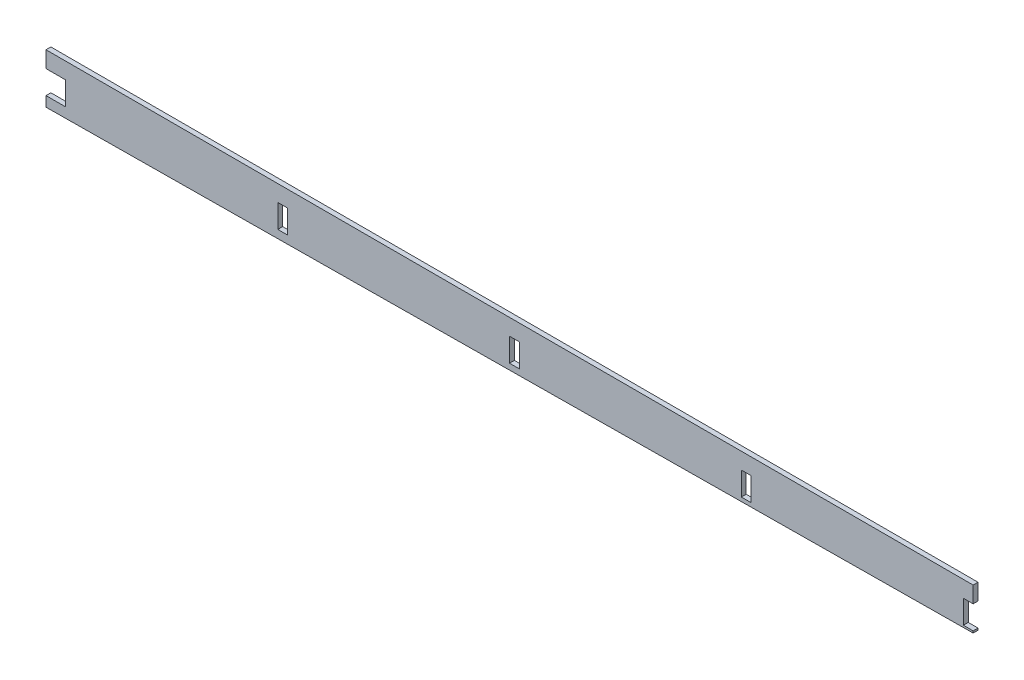
ISO-10303-21;
HEADER;
FILE_DESCRIPTION(('STEP AP214'),'2;1');
FILE_NAME('part.step','',(''),(''),'','','');
FILE_SCHEMA(('AUTOMOTIVE_DESIGN { 1 0 10303 214 1 1 1 1 }'));
ENDSEC;
DATA;
#1=APPLICATION_CONTEXT('core data for automotive mechanical design processes');
#2=APPLICATION_PROTOCOL_DEFINITION('international standard','automotive_design',2000,#1);
#3=PRODUCT_CONTEXT('',#1,'mechanical');
#4=PRODUCT('Part','Part','',(#3));
#5=PRODUCT_RELATED_PRODUCT_CATEGORY('part','',(#4));
#6=PRODUCT_DEFINITION_FORMATION('','',#4);
#7=PRODUCT_DEFINITION_CONTEXT('part definition',#1,'design');
#8=PRODUCT_DEFINITION('design','',#6,#7);
#9=PRODUCT_DEFINITION_SHAPE('','',#8);
#10=(LENGTH_UNIT() NAMED_UNIT(*) SI_UNIT(.MILLI.,.METRE.));
#11=(NAMED_UNIT(*) PLANE_ANGLE_UNIT() SI_UNIT($,.RADIAN.));
#12=(NAMED_UNIT(*) SI_UNIT($,.STERADIAN.) SOLID_ANGLE_UNIT());
#13=UNCERTAINTY_MEASURE_WITH_UNIT(LENGTH_MEASURE(1.E-05),#10,'distance_accuracy_value','');
#14=(GEOMETRIC_REPRESENTATION_CONTEXT(3) GLOBAL_UNCERTAINTY_ASSIGNED_CONTEXT((#13)) GLOBAL_UNIT_ASSIGNED_CONTEXT((#10,
#11,#12)) REPRESENTATION_CONTEXT('',''));
#15=CARTESIAN_POINT('',(0.,0.,0.));
#16=DIRECTION('',(0.,0.,1.));
#17=DIRECTION('',(1.,0.,0.));
#18=AXIS2_PLACEMENT_3D('',#15,#16,#17);
#19=CARTESIAN_POINT('',(0.,0.,1.5875));
#20=DIRECTION('',(0.,0.,1.));
#21=DIRECTION('',(1.,0.,0.));
#22=AXIS2_PLACEMENT_3D('',#19,#20,#21);
#23=PLANE('',#22);
#24=DIRECTION('',(0.,1.,0.));
#25=VECTOR('',#24,1.);
#26=CARTESIAN_POINT('',(232.626798957982,26.1529796334205,1.5875));
#27=LINE('',#26,#25);
#28=CARTESIAN_POINT('',(232.626798957982,25.5277726852554,1.5875));
#29=VERTEX_POINT('',#28);
#30=CARTESIAN_POINT('',(232.626798957982,26.1529796334205,1.5875));
#31=VERTEX_POINT('',#30);
#32=EDGE_CURVE('E291',#29,#31,#27,.T.);
#33=ORIENTED_EDGE('',*,*,#32,.T.);
#34=DIRECTION('',(-1.,0.,0.));
#35=VECTOR('',#34,1.);
#36=CARTESIAN_POINT('',(229.451798957982,26.1529796334205,1.5875));
#37=LINE('',#36,#35);
#38=CARTESIAN_POINT('',(229.451798957982,26.1529796334205,1.5875));
#39=VERTEX_POINT('',#38);
#40=EDGE_CURVE('E294',#31,#39,#37,.T.);
#41=ORIENTED_EDGE('',*,*,#40,.T.);
#42=DIRECTION('',(0.,1.,0.));
#43=VECTOR('',#42,1.);
#44=CARTESIAN_POINT('',(229.451798957982,33.7729796334204,1.5875));
#45=LINE('',#44,#43);
#46=CARTESIAN_POINT('',(229.451798957982,33.7729796334204,1.5875));
#47=VERTEX_POINT('',#46);
#48=EDGE_CURVE('E297',#39,#47,#45,.T.);
#49=ORIENTED_EDGE('',*,*,#48,.T.);
#50=DIRECTION('',(1.,0.,0.));
#51=VECTOR('',#50,1.);
#52=CARTESIAN_POINT('',(232.626798957982,33.7729796334204,1.5875));
#53=LINE('',#52,#51);
#54=CARTESIAN_POINT('',(232.626798957982,33.7729796334204,1.5875));
#55=VERTEX_POINT('',#54);
#56=EDGE_CURVE('E299',#47,#55,#53,.T.);
#57=ORIENTED_EDGE('',*,*,#56,.T.);
#58=DIRECTION('',(0.,1.,0.));
#59=VECTOR('',#58,1.);
#60=CARTESIAN_POINT('',(232.626798957982,39.0942654896149,1.5875));
#61=LINE('',#60,#59);
#62=CARTESIAN_POINT('',(232.626798957982,39.0942654896149,1.5875));
#63=VERTEX_POINT('',#62);
#64=EDGE_CURVE('E301',#55,#63,#61,.T.);
#65=ORIENTED_EDGE('',*,*,#64,.T.);
#66=DIRECTION('',(-1.,0.,0.));
#67=VECTOR('',#66,1.);
#68=CARTESIAN_POINT('',(-69.6332010420179,39.0942654896149,1.5875));
#69=LINE('',#68,#67);
#70=CARTESIAN_POINT('',(-69.6332010420179,39.0942654896149,1.5875));
#71=VERTEX_POINT('',#70);
#72=EDGE_CURVE('E303',#63,#71,#69,.T.);
#73=ORIENTED_EDGE('',*,*,#72,.T.);
#74=DIRECTION('',(0.,-1.,0.));
#75=VECTOR('',#74,1.);
#76=CARTESIAN_POINT('',(-69.6332010420179,33.7729796334204,1.5875));
#77=LINE('',#76,#75);
#78=CARTESIAN_POINT('',(-69.6332010420179,33.7729796334204,1.5875));
#79=VERTEX_POINT('',#78);
#80=EDGE_CURVE('E305',#71,#79,#77,.T.);
#81=ORIENTED_EDGE('',*,*,#80,.T.);
#82=DIRECTION('',(1.,0.,0.));
#83=VECTOR('',#82,1.);
#84=CARTESIAN_POINT('',(-63.2832010420179,33.7729796334204,1.5875));
#85=LINE('',#84,#83);
#86=CARTESIAN_POINT('',(-63.2832010420179,33.7729796334204,1.5875));
#87=VERTEX_POINT('',#86);
#88=EDGE_CURVE('E307',#79,#87,#85,.T.);
#89=ORIENTED_EDGE('',*,*,#88,.T.);
#90=DIRECTION('',(0.,-1.,0.));
#91=VECTOR('',#90,1.);
#92=CARTESIAN_POINT('',(-63.2832010420179,26.1529796334205,1.5875));
#93=LINE('',#92,#91);
#94=CARTESIAN_POINT('',(-63.2832010420179,26.1529796334205,1.5875));
#95=VERTEX_POINT('',#94);
#96=EDGE_CURVE('E309',#87,#95,#93,.T.);
#97=ORIENTED_EDGE('',*,*,#96,.T.);
#98=DIRECTION('',(-1.,0.,0.));
#99=VECTOR('',#98,1.);
#100=CARTESIAN_POINT('',(-69.6332010420179,26.1529796334205,1.5875));
#101=LINE('',#100,#99);
#102=CARTESIAN_POINT('',(-69.6332010420179,26.1529796334205,1.5875));
#103=VERTEX_POINT('',#102);
#104=EDGE_CURVE('E311',#95,#103,#101,.T.);
#105=ORIENTED_EDGE('',*,*,#104,.T.);
#106=DIRECTION('',(0.,-1.,0.));
#107=VECTOR('',#106,1.);
#108=CARTESIAN_POINT('',(-69.6332010420179,22.8671224610524,1.5875));
#109=LINE('',#108,#107);
#110=CARTESIAN_POINT('',(-69.6332010420179,22.8671224610524,1.5875));
#111=VERTEX_POINT('',#110);
#112=EDGE_CURVE('E313',#103,#111,#109,.T.);
#113=ORIENTED_EDGE('',*,*,#112,.T.);
#114=DIRECTION('',(0.99996126005671,0.00880218074096521,0.));
#115=VECTOR('',#114,1.);
#116=CARTESIAN_POINT('',(232.626798957982,25.5277726852554,1.5875));
#117=LINE('',#116,#115);
#118=EDGE_CURVE('E315',#111,#29,#117,.T.);
#119=ORIENTED_EDGE('',*,*,#118,.T.);
#120=EDGE_LOOP('',(#33,#41,#49,#57,#65,#73,#81,#89,#97,#105,#113,#119));
#121=FACE_BOUND('',#120,.T.);
#122=DIRECTION('',(-1.,0.,0.));
#123=VECTOR('',#122,1.);
#124=CARTESIAN_POINT('',(157.061798957982,33.7729796334204,1.5875));
#125=LINE('',#124,#123);
#126=CARTESIAN_POINT('',(160.236798957982,33.7729796334204,1.5875));
#127=VERTEX_POINT('',#126);
#128=CARTESIAN_POINT('',(157.061798957982,33.7729796334204,1.5875));
#129=VERTEX_POINT('',#128);
#130=EDGE_CURVE('E262',#127,#129,#125,.T.);
#131=ORIENTED_EDGE('',*,*,#130,.F.);
#132=DIRECTION('',(0.,1.,0.));
#133=VECTOR('',#132,1.);
#134=CARTESIAN_POINT('',(160.236798957982,33.7729796334204,1.5875));
#135=LINE('',#134,#133);
#136=CARTESIAN_POINT('',(160.236798957982,26.1529796334204,1.5875));
#137=VERTEX_POINT('',#136);
#138=EDGE_CURVE('E260',#137,#127,#135,.T.);
#139=ORIENTED_EDGE('',*,*,#138,.F.);
#140=DIRECTION('',(1.,0.,0.));
#141=VECTOR('',#140,1.);
#142=CARTESIAN_POINT('',(160.236798957982,26.1529796334204,1.5875));
#143=LINE('',#142,#141);
#144=CARTESIAN_POINT('',(157.061798957982,26.1529796334204,1.5875));
#145=VERTEX_POINT('',#144);
#146=EDGE_CURVE('E268',#145,#137,#143,.T.);
#147=ORIENTED_EDGE('',*,*,#146,.F.);
#148=DIRECTION('',(0.,-1.,0.));
#149=VECTOR('',#148,1.);
#150=CARTESIAN_POINT('',(157.061798957982,26.1529796334204,1.5875));
#151=LINE('',#150,#149);
#152=EDGE_CURVE('E265',#129,#145,#151,.T.);
#153=ORIENTED_EDGE('',*,*,#152,.F.);
#154=EDGE_LOOP('',(#131,#139,#147,#153));
#155=FACE_BOUND('',#154,.T.);
#156=DIRECTION('',(-1.,0.,0.));
#157=VECTOR('',#156,1.);
#158=CARTESIAN_POINT('',(81.496798957982,33.7729796334204,1.5875));
#159=LINE('',#158,#157);
#160=CARTESIAN_POINT('',(84.671798957982,33.7729796334204,1.5875));
#161=VERTEX_POINT('',#160);
#162=CARTESIAN_POINT('',(81.496798957982,33.7729796334204,1.5875));
#163=VERTEX_POINT('',#162);
#164=EDGE_CURVE('E231',#161,#163,#159,.T.);
#165=ORIENTED_EDGE('',*,*,#164,.F.);
#166=DIRECTION('',(0.,1.,0.));
#167=VECTOR('',#166,1.);
#168=CARTESIAN_POINT('',(84.671798957982,33.7729796334204,1.5875));
#169=LINE('',#168,#167);
#170=CARTESIAN_POINT('',(84.671798957982,26.1529796334204,1.5875));
#171=VERTEX_POINT('',#170);
#172=EDGE_CURVE('E229',#171,#161,#169,.T.);
#173=ORIENTED_EDGE('',*,*,#172,.F.);
#174=DIRECTION('',(1.,0.,0.));
#175=VECTOR('',#174,1.);
#176=CARTESIAN_POINT('',(84.671798957982,26.1529796334204,1.5875));
#177=LINE('',#176,#175);
#178=CARTESIAN_POINT('',(81.496798957982,26.1529796334204,1.5875));
#179=VERTEX_POINT('',#178);
#180=EDGE_CURVE('E237',#179,#171,#177,.T.);
#181=ORIENTED_EDGE('',*,*,#180,.F.);
#182=DIRECTION('',(0.,-1.,0.));
#183=VECTOR('',#182,1.);
#184=CARTESIAN_POINT('',(81.496798957982,26.1529796334204,1.5875));
#185=LINE('',#184,#183);
#186=EDGE_CURVE('E234',#163,#179,#185,.T.);
#187=ORIENTED_EDGE('',*,*,#186,.F.);
#188=EDGE_LOOP('',(#165,#173,#181,#187));
#189=FACE_BOUND('',#188,.T.);
#190=DIRECTION('',(-1.,0.,0.));
#191=VECTOR('',#190,1.);
#192=CARTESIAN_POINT('',(5.93179895798208,33.7729796334204,1.5875));
#193=LINE('',#192,#191);
#194=CARTESIAN_POINT('',(9.10679895798208,33.7729796334204,1.5875));
#195=VERTEX_POINT('',#194);
#196=CARTESIAN_POINT('',(5.93179895798208,33.7729796334204,1.5875));
#197=VERTEX_POINT('',#196);
#198=EDGE_CURVE('E201',#195,#197,#193,.T.);
#199=ORIENTED_EDGE('',*,*,#198,.F.);
#200=DIRECTION('',(0.,1.,0.));
#201=VECTOR('',#200,1.);
#202=CARTESIAN_POINT('',(9.10679895798208,33.7729796334204,1.5875));
#203=LINE('',#202,#201);
#204=CARTESIAN_POINT('',(9.10679895798208,26.1529796334204,1.5875));
#205=VERTEX_POINT('',#204);
#206=EDGE_CURVE('E193',#205,#195,#203,.T.);
#207=ORIENTED_EDGE('',*,*,#206,.F.);
#208=DIRECTION('',(1.,0.,0.));
#209=VECTOR('',#208,1.);
#210=CARTESIAN_POINT('',(9.10679895798208,26.1529796334204,1.5875));
#211=LINE('',#210,#209);
#212=CARTESIAN_POINT('',(5.93179895798208,26.1529796334205,1.5875));
#213=VERTEX_POINT('',#212);
#214=EDGE_CURVE('E215',#213,#205,#211,.T.);
#215=ORIENTED_EDGE('',*,*,#214,.F.);
#216=DIRECTION('',(0.,-1.,0.));
#217=VECTOR('',#216,1.);
#218=CARTESIAN_POINT('',(5.93179895798208,26.1529796334205,1.5875));
#219=LINE('',#218,#217);
#220=EDGE_CURVE('E213',#197,#213,#219,.T.);
#221=ORIENTED_EDGE('',*,*,#220,.F.);
#222=EDGE_LOOP('',(#199,#207,#215,#221));
#223=FACE_BOUND('',#222,.T.);
#224=ADVANCED_FACE('F32',(#121,#155,#189,#223),#23,.T.);
#225=CARTESIAN_POINT('',(0.,0.,0.));
#226=DIRECTION('',(0.,0.,1.));
#227=DIRECTION('',(1.,0.,0.));
#228=AXIS2_PLACEMENT_3D('',#225,#226,#227);
#229=PLANE('',#228);
#230=DIRECTION('',(0.,1.,0.));
#231=VECTOR('',#230,1.);
#232=CARTESIAN_POINT('',(84.671798957982,33.7729796334204,0.));
#233=LINE('',#232,#231);
#234=CARTESIAN_POINT('',(84.671798957982,26.1529796334204,0.));
#235=VERTEX_POINT('',#234);
#236=CARTESIAN_POINT('',(84.671798957982,33.7729796334204,0.));
#237=VERTEX_POINT('',#236);
#238=EDGE_CURVE('E209',#235,#237,#233,.T.);
#239=ORIENTED_EDGE('',*,*,#238,.T.);
#240=DIRECTION('',(-1.,0.,0.));
#241=VECTOR('',#240,1.);
#242=CARTESIAN_POINT('',(81.496798957982,33.7729796334204,0.));
#243=LINE('',#242,#241);
#244=CARTESIAN_POINT('',(81.496798957982,33.7729796334204,0.));
#245=VERTEX_POINT('',#244);
#246=EDGE_CURVE('E242',#237,#245,#243,.T.);
#247=ORIENTED_EDGE('',*,*,#246,.T.);
#248=DIRECTION('',(0.,-1.,0.));
#249=VECTOR('',#248,1.);
#250=CARTESIAN_POINT('',(81.496798957982,26.1529796334204,0.));
#251=LINE('',#250,#249);
#252=CARTESIAN_POINT('',(81.496798957982,26.1529796334204,0.));
#253=VERTEX_POINT('',#252);
#254=EDGE_CURVE('E245',#245,#253,#251,.T.);
#255=ORIENTED_EDGE('',*,*,#254,.T.);
#256=DIRECTION('',(1.,0.,0.));
#257=VECTOR('',#256,1.);
#258=CARTESIAN_POINT('',(84.671798957982,26.1529796334204,0.));
#259=LINE('',#258,#257);
#260=EDGE_CURVE('E232',#253,#235,#259,.T.);
#261=ORIENTED_EDGE('',*,*,#260,.T.);
#262=EDGE_LOOP('',(#239,#247,#255,#261));
#263=FACE_BOUND('',#262,.T.);
#264=DIRECTION('',(0.,1.,0.));
#265=VECTOR('',#264,1.);
#266=CARTESIAN_POINT('',(232.626798957982,26.1529796334205,0.));
#267=LINE('',#266,#265);
#268=CARTESIAN_POINT('',(232.626798957982,25.5277726852554,0.));
#269=VERTEX_POINT('',#268);
#270=CARTESIAN_POINT('',(232.626798957982,26.1529796334205,0.));
#271=VERTEX_POINT('',#270);
#272=EDGE_CURVE('E290',#269,#271,#267,.T.);
#273=ORIENTED_EDGE('',*,*,#272,.F.);
#274=DIRECTION('',(0.99996126005671,0.00880218074096521,0.));
#275=VECTOR('',#274,1.);
#276=CARTESIAN_POINT('',(232.626798957982,25.5277726852554,0.));
#277=LINE('',#276,#275);
#278=CARTESIAN_POINT('',(-69.6332010420179,22.8671224610524,0.));
#279=VERTEX_POINT('',#278);
#280=EDGE_CURVE('E295',#279,#269,#277,.T.);
#281=ORIENTED_EDGE('',*,*,#280,.F.);
#282=DIRECTION('',(0.,-1.,0.));
#283=VECTOR('',#282,1.);
#284=CARTESIAN_POINT('',(-69.6332010420179,22.8671224610524,0.));
#285=LINE('',#284,#283);
#286=CARTESIAN_POINT('',(-69.6332010420179,26.1529796334205,0.));
#287=VERTEX_POINT('',#286);
#288=EDGE_CURVE('E338',#287,#279,#285,.T.);
#289=ORIENTED_EDGE('',*,*,#288,.F.);
#290=DIRECTION('',(-1.,0.,0.));
#291=VECTOR('',#290,1.);
#292=CARTESIAN_POINT('',(-69.6332010420179,26.1529796334205,0.));
#293=LINE('',#292,#291);
#294=CARTESIAN_POINT('',(-63.2832010420179,26.1529796334205,0.));
#295=VERTEX_POINT('',#294);
#296=EDGE_CURVE('E336',#295,#287,#293,.T.);
#297=ORIENTED_EDGE('',*,*,#296,.F.);
#298=DIRECTION('',(0.,-1.,0.));
#299=VECTOR('',#298,1.);
#300=CARTESIAN_POINT('',(-63.2832010420179,26.1529796334205,0.));
#301=LINE('',#300,#299);
#302=CARTESIAN_POINT('',(-63.2832010420179,33.7729796334204,0.));
#303=VERTEX_POINT('',#302);
#304=EDGE_CURVE('E334',#303,#295,#301,.T.);
#305=ORIENTED_EDGE('',*,*,#304,.F.);
#306=DIRECTION('',(1.,0.,0.));
#307=VECTOR('',#306,1.);
#308=CARTESIAN_POINT('',(-63.2832010420179,33.7729796334204,0.));
#309=LINE('',#308,#307);
#310=CARTESIAN_POINT('',(-69.6332010420179,33.7729796334204,0.));
#311=VERTEX_POINT('',#310);
#312=EDGE_CURVE('E332',#311,#303,#309,.T.);
#313=ORIENTED_EDGE('',*,*,#312,.F.);
#314=DIRECTION('',(0.,-1.,0.));
#315=VECTOR('',#314,1.);
#316=CARTESIAN_POINT('',(-69.6332010420179,33.7729796334204,0.));
#317=LINE('',#316,#315);
#318=CARTESIAN_POINT('',(-69.6332010420179,39.0942654896149,0.));
#319=VERTEX_POINT('',#318);
#320=EDGE_CURVE('E330',#319,#311,#317,.T.);
#321=ORIENTED_EDGE('',*,*,#320,.F.);
#322=DIRECTION('',(-1.,0.,0.));
#323=VECTOR('',#322,1.);
#324=CARTESIAN_POINT('',(-69.6332010420179,39.0942654896149,0.));
#325=LINE('',#324,#323);
#326=CARTESIAN_POINT('',(232.626798957982,39.0942654896149,0.));
#327=VERTEX_POINT('',#326);
#328=EDGE_CURVE('E328',#327,#319,#325,.T.);
#329=ORIENTED_EDGE('',*,*,#328,.F.);
#330=DIRECTION('',(0.,1.,0.));
#331=VECTOR('',#330,1.);
#332=CARTESIAN_POINT('',(232.626798957982,39.0942654896149,0.));
#333=LINE('',#332,#331);
#334=CARTESIAN_POINT('',(232.626798957982,33.7729796334204,0.));
#335=VERTEX_POINT('',#334);
#336=EDGE_CURVE('E326',#335,#327,#333,.T.);
#337=ORIENTED_EDGE('',*,*,#336,.F.);
#338=DIRECTION('',(1.,0.,0.));
#339=VECTOR('',#338,1.);
#340=CARTESIAN_POINT('',(232.626798957982,33.7729796334204,0.));
#341=LINE('',#340,#339);
#342=CARTESIAN_POINT('',(229.451798957982,33.7729796334204,0.));
#343=VERTEX_POINT('',#342);
#344=EDGE_CURVE('E324',#343,#335,#341,.T.);
#345=ORIENTED_EDGE('',*,*,#344,.F.);
#346=DIRECTION('',(0.,1.,0.));
#347=VECTOR('',#346,1.);
#348=CARTESIAN_POINT('',(229.451798957982,33.7729796334204,0.));
#349=LINE('',#348,#347);
#350=CARTESIAN_POINT('',(229.451798957982,26.1529796334205,0.));
#351=VERTEX_POINT('',#350);
#352=EDGE_CURVE('E322',#351,#343,#349,.T.);
#353=ORIENTED_EDGE('',*,*,#352,.F.);
#354=DIRECTION('',(-1.,0.,0.));
#355=VECTOR('',#354,1.);
#356=CARTESIAN_POINT('',(229.451798957982,26.1529796334205,0.));
#357=LINE('',#356,#355);
#358=EDGE_CURVE('E320',#271,#351,#357,.T.);
#359=ORIENTED_EDGE('',*,*,#358,.F.);
#360=EDGE_LOOP('',(#273,#281,#289,#297,#305,#313,#321,#329,#337,#345,#353,#359));
#361=FACE_BOUND('',#360,.T.);
#362=DIRECTION('',(0.,1.,0.));
#363=VECTOR('',#362,1.);
#364=CARTESIAN_POINT('',(160.236798957982,33.7729796334204,0.));
#365=LINE('',#364,#363);
#366=CARTESIAN_POINT('',(160.236798957982,26.1529796334204,0.));
#367=VERTEX_POINT('',#366);
#368=CARTESIAN_POINT('',(160.236798957982,33.7729796334204,0.));
#369=VERTEX_POINT('',#368);
#370=EDGE_CURVE('E259',#367,#369,#365,.T.);
#371=ORIENTED_EDGE('',*,*,#370,.T.);
#372=DIRECTION('',(-1.,0.,0.));
#373=VECTOR('',#372,1.);
#374=CARTESIAN_POINT('',(157.061798957982,33.7729796334204,0.));
#375=LINE('',#374,#373);
#376=CARTESIAN_POINT('',(157.061798957982,33.7729796334204,0.));
#377=VERTEX_POINT('',#376);
#378=EDGE_CURVE('E273',#369,#377,#375,.T.);
#379=ORIENTED_EDGE('',*,*,#378,.T.);
#380=DIRECTION('',(0.,-1.,0.));
#381=VECTOR('',#380,1.);
#382=CARTESIAN_POINT('',(157.061798957982,26.1529796334204,0.));
#383=LINE('',#382,#381);
#384=CARTESIAN_POINT('',(157.061798957982,26.1529796334204,0.));
#385=VERTEX_POINT('',#384);
#386=EDGE_CURVE('E276',#377,#385,#383,.T.);
#387=ORIENTED_EDGE('',*,*,#386,.T.);
#388=DIRECTION('',(1.,0.,0.));
#389=VECTOR('',#388,1.);
#390=CARTESIAN_POINT('',(160.236798957982,26.1529796334204,0.));
#391=LINE('',#390,#389);
#392=EDGE_CURVE('E263',#385,#367,#391,.T.);
#393=ORIENTED_EDGE('',*,*,#392,.T.);
#394=EDGE_LOOP('',(#371,#379,#387,#393));
#395=FACE_BOUND('',#394,.T.);
#396=DIRECTION('',(0.,1.,0.));
#397=VECTOR('',#396,1.);
#398=CARTESIAN_POINT('',(9.10679895798208,33.7729796334204,0.));
#399=LINE('',#398,#397);
#400=CARTESIAN_POINT('',(9.10679895798208,26.1529796334204,0.));
#401=VERTEX_POINT('',#400);
#402=CARTESIAN_POINT('',(9.10679895798208,33.7729796334204,0.));
#403=VERTEX_POINT('',#402);
#404=EDGE_CURVE('E55',#401,#403,#399,.T.);
#405=ORIENTED_EDGE('',*,*,#404,.T.);
#406=DIRECTION('',(-1.,0.,0.));
#407=VECTOR('',#406,1.);
#408=CARTESIAN_POINT('',(5.93179895798208,33.7729796334204,0.));
#409=LINE('',#408,#407);
#410=CARTESIAN_POINT('',(5.93179895798208,33.7729796334204,0.));
#411=VERTEX_POINT('',#410);
#412=EDGE_CURVE('E208',#403,#411,#409,.T.);
#413=ORIENTED_EDGE('',*,*,#412,.T.);
#414=DIRECTION('',(0.,-1.,0.));
#415=VECTOR('',#414,1.);
#416=CARTESIAN_POINT('',(5.93179895798208,26.1529796334205,0.));
#417=LINE('',#416,#415);
#418=CARTESIAN_POINT('',(5.93179895798208,26.1529796334205,0.));
#419=VERTEX_POINT('',#418);
#420=EDGE_CURVE('E221',#411,#419,#417,.T.);
#421=ORIENTED_EDGE('',*,*,#420,.T.);
#422=DIRECTION('',(1.,0.,0.));
#423=VECTOR('',#422,1.);
#424=CARTESIAN_POINT('',(9.10679895798208,26.1529796334204,0.));
#425=LINE('',#424,#423);
#426=EDGE_CURVE('E202',#419,#401,#425,.T.);
#427=ORIENTED_EDGE('',*,*,#426,.T.);
#428=EDGE_LOOP('',(#405,#413,#421,#427));
#429=FACE_BOUND('',#428,.T.);
#430=ADVANCED_FACE('F380',(#263,#361,#395,#429),#229,.F.);
#431=CARTESIAN_POINT('',(232.626798957982,26.1529796334205,1.5875));
#432=DIRECTION('',(-1.,0.,0.));
#433=DIRECTION('',(0.,-1.,0.));
#434=AXIS2_PLACEMENT_3D('',#431,#432,#433);
#435=PLANE('',#434);
#436=ORIENTED_EDGE('',*,*,#272,.T.);
#437=DIRECTION('',(0.,0.,-1.));
#438=VECTOR('',#437,1.);
#439=CARTESIAN_POINT('',(232.626798957982,26.1529796334205,1.5875));
#440=LINE('',#439,#438);
#441=EDGE_CURVE('E11',#31,#271,#440,.T.);
#442=ORIENTED_EDGE('',*,*,#441,.F.);
#443=ORIENTED_EDGE('',*,*,#32,.F.);
#444=DIRECTION('',(0.,0.,-1.));
#445=VECTOR('',#444,1.);
#446=CARTESIAN_POINT('',(232.626798957982,25.5277726852554,1.5875));
#447=LINE('',#446,#445);
#448=EDGE_CURVE('E317',#29,#269,#447,.T.);
#449=ORIENTED_EDGE('',*,*,#448,.T.);
#450=EDGE_LOOP('',(#436,#442,#443,#449));
#451=FACE_BOUND('',#450,.T.);
#452=ADVANCED_FACE('F34',(#451),#435,.F.);
#453=CARTESIAN_POINT('',(229.451798957982,26.1529796334205,1.5875));
#454=DIRECTION('',(0.,-1.,0.));
#455=DIRECTION('',(0.,0.,-1.));
#456=AXIS2_PLACEMENT_3D('',#453,#454,#455);
#457=PLANE('',#456);
#458=ORIENTED_EDGE('',*,*,#358,.T.);
#459=DIRECTION('',(0.,0.,-1.));
#460=VECTOR('',#459,1.);
#461=CARTESIAN_POINT('',(229.451798957982,26.1529796334205,1.5875));
#462=LINE('',#461,#460);
#463=EDGE_CURVE('E40',#39,#351,#462,.T.);
#464=ORIENTED_EDGE('',*,*,#463,.F.);
#465=ORIENTED_EDGE('',*,*,#40,.F.);
#466=ORIENTED_EDGE('',*,*,#441,.T.);
#467=EDGE_LOOP('',(#458,#464,#465,#466));
#468=FACE_BOUND('',#467,.T.);
#469=ADVANCED_FACE('F398',(#468),#457,.F.);
#470=CARTESIAN_POINT('',(229.451798957982,33.7729796334204,1.5875));
#471=DIRECTION('',(-1.,0.,0.));
#472=DIRECTION('',(0.,0.,1.));
#473=AXIS2_PLACEMENT_3D('',#470,#471,#472);
#474=PLANE('',#473);
#475=ORIENTED_EDGE('',*,*,#352,.T.);
#476=DIRECTION('',(0.,0.,-1.));
#477=VECTOR('',#476,1.);
#478=CARTESIAN_POINT('',(229.451798957982,33.7729796334204,1.5875));
#479=LINE('',#478,#477);
#480=EDGE_CURVE('E367',#47,#343,#479,.T.);
#481=ORIENTED_EDGE('',*,*,#480,.F.);
#482=ORIENTED_EDGE('',*,*,#48,.F.);
#483=ORIENTED_EDGE('',*,*,#463,.T.);
#484=EDGE_LOOP('',(#475,#481,#482,#483));
#485=FACE_BOUND('',#484,.T.);
#486=ADVANCED_FACE('F374',(#485),#474,.F.);
#487=CARTESIAN_POINT('',(232.626798957982,33.7729796334204,1.5875));
#488=DIRECTION('',(0.,1.,0.));
#489=DIRECTION('',(0.,0.,1.));
#490=AXIS2_PLACEMENT_3D('',#487,#488,#489);
#491=PLANE('',#490);
#492=ORIENTED_EDGE('',*,*,#344,.T.);
#493=DIRECTION('',(0.,0.,-1.));
#494=VECTOR('',#493,1.);
#495=CARTESIAN_POINT('',(232.626798957982,33.7729796334204,1.5875));
#496=LINE('',#495,#494);
#497=EDGE_CURVE('E364',#55,#335,#496,.T.);
#498=ORIENTED_EDGE('',*,*,#497,.F.);
#499=ORIENTED_EDGE('',*,*,#56,.F.);
#500=ORIENTED_EDGE('',*,*,#480,.T.);
#501=EDGE_LOOP('',(#492,#498,#499,#500));
#502=FACE_BOUND('',#501,.T.);
#503=ADVANCED_FACE('F386',(#502),#491,.F.);
#504=CARTESIAN_POINT('',(232.626798957982,39.0942654896149,1.5875));
#505=DIRECTION('',(-1.,0.,0.));
#506=DIRECTION('',(0.,0.,1.));
#507=AXIS2_PLACEMENT_3D('',#504,#505,#506);
#508=PLANE('',#507);
#509=ORIENTED_EDGE('',*,*,#336,.T.);
#510=DIRECTION('',(0.,0.,-1.));
#511=VECTOR('',#510,1.);
#512=CARTESIAN_POINT('',(232.626798957982,39.0942654896149,1.5875));
#513=LINE('',#512,#511);
#514=EDGE_CURVE('E361',#63,#327,#513,.T.);
#515=ORIENTED_EDGE('',*,*,#514,.F.);
#516=ORIENTED_EDGE('',*,*,#64,.F.);
#517=ORIENTED_EDGE('',*,*,#497,.T.);
#518=EDGE_LOOP('',(#509,#515,#516,#517));
#519=FACE_BOUND('',#518,.T.);
#520=ADVANCED_FACE('F390',(#519),#508,.F.);
#521=CARTESIAN_POINT('',(-69.6332010420179,39.0942654896149,1.5875));
#522=DIRECTION('',(0.,-1.,0.));
#523=DIRECTION('',(1.,0.,0.));
#524=AXIS2_PLACEMENT_3D('',#521,#522,#523);
#525=PLANE('',#524);
#526=ORIENTED_EDGE('',*,*,#328,.T.);
#527=DIRECTION('',(0.,0.,-1.));
#528=VECTOR('',#527,1.);
#529=CARTESIAN_POINT('',(-69.6332010420179,39.0942654896149,1.5875));
#530=LINE('',#529,#528);
#531=EDGE_CURVE('E358',#71,#319,#530,.T.);
#532=ORIENTED_EDGE('',*,*,#531,.F.);
#533=ORIENTED_EDGE('',*,*,#72,.F.);
#534=ORIENTED_EDGE('',*,*,#514,.T.);
#535=EDGE_LOOP('',(#526,#532,#533,#534));
#536=FACE_BOUND('',#535,.T.);
#537=ADVANCED_FACE('F431',(#536),#525,.F.);
#538=CARTESIAN_POINT('',(-69.6332010420179,33.7729796334204,1.5875));
#539=DIRECTION('',(1.,0.,0.));
#540=DIRECTION('',(0.,0.,-1.));
#541=AXIS2_PLACEMENT_3D('',#538,#539,#540);
#542=PLANE('',#541);
#543=ORIENTED_EDGE('',*,*,#320,.T.);
#544=DIRECTION('',(0.,0.,-1.));
#545=VECTOR('',#544,1.);
#546=CARTESIAN_POINT('',(-69.6332010420179,33.7729796334204,1.5875));
#547=LINE('',#546,#545);
#548=EDGE_CURVE('E355',#79,#311,#547,.T.);
#549=ORIENTED_EDGE('',*,*,#548,.F.);
#550=ORIENTED_EDGE('',*,*,#80,.F.);
#551=ORIENTED_EDGE('',*,*,#531,.T.);
#552=EDGE_LOOP('',(#543,#549,#550,#551));
#553=FACE_BOUND('',#552,.T.);
#554=ADVANCED_FACE('F429',(#553),#542,.F.);
#555=CARTESIAN_POINT('',(-63.2832010420179,33.7729796334204,1.5875));
#556=DIRECTION('',(0.,1.,0.));
#557=DIRECTION('',(-1.,0.,0.));
#558=AXIS2_PLACEMENT_3D('',#555,#556,#557);
#559=PLANE('',#558);
#560=ORIENTED_EDGE('',*,*,#312,.T.);
#561=DIRECTION('',(0.,0.,-1.));
#562=VECTOR('',#561,1.);
#563=CARTESIAN_POINT('',(-63.2832010420179,33.7729796334204,1.5875));
#564=LINE('',#563,#562);
#565=EDGE_CURVE('E352',#87,#303,#564,.T.);
#566=ORIENTED_EDGE('',*,*,#565,.F.);
#567=ORIENTED_EDGE('',*,*,#88,.F.);
#568=ORIENTED_EDGE('',*,*,#548,.T.);
#569=EDGE_LOOP('',(#560,#566,#567,#568));
#570=FACE_BOUND('',#569,.T.);
#571=ADVANCED_FACE('F425',(#570),#559,.F.);
#572=CARTESIAN_POINT('',(-63.2832010420179,26.1529796334205,1.5875));
#573=DIRECTION('',(1.,0.,0.));
#574=DIRECTION('',(0.,0.,-1.));
#575=AXIS2_PLACEMENT_3D('',#572,#573,#574);
#576=PLANE('',#575);
#577=ORIENTED_EDGE('',*,*,#304,.T.);
#578=DIRECTION('',(0.,0.,-1.));
#579=VECTOR('',#578,1.);
#580=CARTESIAN_POINT('',(-63.2832010420179,26.1529796334205,1.5875));
#581=LINE('',#580,#579);
#582=EDGE_CURVE('E349',#95,#295,#581,.T.);
#583=ORIENTED_EDGE('',*,*,#582,.F.);
#584=ORIENTED_EDGE('',*,*,#96,.F.);
#585=ORIENTED_EDGE('',*,*,#565,.T.);
#586=EDGE_LOOP('',(#577,#583,#584,#585));
#587=FACE_BOUND('',#586,.T.);
#588=ADVANCED_FACE('F420',(#587),#576,.F.);
#589=CARTESIAN_POINT('',(-69.6332010420179,26.1529796334205,1.5875));
#590=DIRECTION('',(0.,-1.,0.));
#591=DIRECTION('',(1.,0.,0.));
#592=AXIS2_PLACEMENT_3D('',#589,#590,#591);
#593=PLANE('',#592);
#594=ORIENTED_EDGE('',*,*,#296,.T.);
#595=DIRECTION('',(0.,0.,-1.));
#596=VECTOR('',#595,1.);
#597=CARTESIAN_POINT('',(-69.6332010420179,26.1529796334205,1.5875));
#598=LINE('',#597,#596);
#599=EDGE_CURVE('E346',#103,#287,#598,.T.);
#600=ORIENTED_EDGE('',*,*,#599,.F.);
#601=ORIENTED_EDGE('',*,*,#104,.F.);
#602=ORIENTED_EDGE('',*,*,#582,.T.);
#603=EDGE_LOOP('',(#594,#600,#601,#602));
#604=FACE_BOUND('',#603,.T.);
#605=ADVANCED_FACE('F414',(#604),#593,.F.);
#606=CARTESIAN_POINT('',(-69.6332010420179,22.8671224610524,1.5875));
#607=DIRECTION('',(1.,0.,0.));
#608=DIRECTION('',(0.,0.,-1.));
#609=AXIS2_PLACEMENT_3D('',#606,#607,#608);
#610=PLANE('',#609);
#611=ORIENTED_EDGE('',*,*,#288,.T.);
#612=DIRECTION('',(0.,0.,-1.));
#613=VECTOR('',#612,1.);
#614=CARTESIAN_POINT('',(-69.6332010420179,22.8671224610524,1.5875));
#615=LINE('',#614,#613);
#616=EDGE_CURVE('E343',#111,#279,#615,.T.);
#617=ORIENTED_EDGE('',*,*,#616,.F.);
#618=ORIENTED_EDGE('',*,*,#112,.F.);
#619=ORIENTED_EDGE('',*,*,#599,.T.);
#620=EDGE_LOOP('',(#611,#617,#618,#619));
#621=FACE_BOUND('',#620,.T.);
#622=ADVANCED_FACE('F410',(#621),#610,.F.);
#623=CARTESIAN_POINT('',(232.626798957982,25.5277726852554,1.5875));
#624=DIRECTION('',(-0.00880218074096521,0.99996126005671,0.));
#625=DIRECTION('',(-0.99996126005671,-0.00880218074096521,0.));
#626=AXIS2_PLACEMENT_3D('',#623,#624,#625);
#627=PLANE('',#626);
#628=ORIENTED_EDGE('',*,*,#280,.T.);
#629=ORIENTED_EDGE('',*,*,#448,.F.);
#630=ORIENTED_EDGE('',*,*,#118,.F.);
#631=ORIENTED_EDGE('',*,*,#616,.T.);
#632=EDGE_LOOP('',(#628,#629,#630,#631));
#633=FACE_BOUND('',#632,.T.);
#634=ADVANCED_FACE('F405',(#633),#627,.F.);
#635=CARTESIAN_POINT('',(160.236798957982,33.7729796334204,1.5875));
#636=DIRECTION('',(-1.,0.,0.));
#637=DIRECTION('',(0.,0.,1.));
#638=AXIS2_PLACEMENT_3D('',#635,#636,#637);
#639=PLANE('',#638);
#640=ORIENTED_EDGE('',*,*,#370,.F.);
#641=DIRECTION('',(0.,0.,-1.));
#642=VECTOR('',#641,1.);
#643=CARTESIAN_POINT('',(160.236798957982,26.1529796334204,1.5875));
#644=LINE('',#643,#642);
#645=EDGE_CURVE('E270',#137,#367,#644,.T.);
#646=ORIENTED_EDGE('',*,*,#645,.F.);
#647=ORIENTED_EDGE('',*,*,#138,.T.);
#648=DIRECTION('',(0.,0.,-1.));
#649=VECTOR('',#648,1.);
#650=CARTESIAN_POINT('',(160.236798957982,33.7729796334204,1.5875));
#651=LINE('',#650,#649);
#652=EDGE_CURVE('E287',#127,#369,#651,.T.);
#653=ORIENTED_EDGE('',*,*,#652,.T.);
#654=EDGE_LOOP('',(#640,#646,#647,#653));
#655=FACE_BOUND('',#654,.T.);
#656=ADVANCED_FACE('F448',(#655),#639,.T.);
#657=CARTESIAN_POINT('',(157.061798957982,33.7729796334204,1.5875));
#658=DIRECTION('',(0.,-1.,0.));
#659=DIRECTION('',(0.,0.,-1.));
#660=AXIS2_PLACEMENT_3D('',#657,#658,#659);
#661=PLANE('',#660);
#662=ORIENTED_EDGE('',*,*,#378,.F.);
#663=ORIENTED_EDGE('',*,*,#652,.F.);
#664=ORIENTED_EDGE('',*,*,#130,.T.);
#665=DIRECTION('',(0.,0.,-1.));
#666=VECTOR('',#665,1.);
#667=CARTESIAN_POINT('',(157.061798957982,33.7729796334204,1.5875));
#668=LINE('',#667,#666);
#669=EDGE_CURVE('E285',#129,#377,#668,.T.);
#670=ORIENTED_EDGE('',*,*,#669,.T.);
#671=EDGE_LOOP('',(#662,#663,#664,#670));
#672=FACE_BOUND('',#671,.T.);
#673=ADVANCED_FACE('F486',(#672),#661,.T.);
#674=CARTESIAN_POINT('',(157.061798957982,26.1529796334204,1.5875));
#675=DIRECTION('',(1.,0.,0.));
#676=DIRECTION('',(0.,0.,-1.));
#677=AXIS2_PLACEMENT_3D('',#674,#675,#676);
#678=PLANE('',#677);
#679=ORIENTED_EDGE('',*,*,#386,.F.);
#680=ORIENTED_EDGE('',*,*,#669,.F.);
#681=ORIENTED_EDGE('',*,*,#152,.T.);
#682=DIRECTION('',(0.,0.,-1.));
#683=VECTOR('',#682,1.);
#684=CARTESIAN_POINT('',(157.061798957982,26.1529796334204,1.5875));
#685=LINE('',#684,#683);
#686=EDGE_CURVE('E283',#145,#385,#685,.T.);
#687=ORIENTED_EDGE('',*,*,#686,.T.);
#688=EDGE_LOOP('',(#679,#680,#681,#687));
#689=FACE_BOUND('',#688,.T.);
#690=ADVANCED_FACE('F493',(#689),#678,.T.);
#691=CARTESIAN_POINT('',(160.236798957982,26.1529796334204,1.5875));
#692=DIRECTION('',(0.,1.,0.));
#693=DIRECTION('',(0.,0.,1.));
#694=AXIS2_PLACEMENT_3D('',#691,#692,#693);
#695=PLANE('',#694);
#696=ORIENTED_EDGE('',*,*,#392,.F.);
#697=ORIENTED_EDGE('',*,*,#686,.F.);
#698=ORIENTED_EDGE('',*,*,#146,.T.);
#699=ORIENTED_EDGE('',*,*,#645,.T.);
#700=EDGE_LOOP('',(#696,#697,#698,#699));
#701=FACE_BOUND('',#700,.T.);
#702=ADVANCED_FACE('F500',(#701),#695,.T.);
#703=CARTESIAN_POINT('',(84.671798957982,33.7729796334204,1.5875));
#704=DIRECTION('',(-1.,0.,0.));
#705=DIRECTION('',(0.,0.,1.));
#706=AXIS2_PLACEMENT_3D('',#703,#704,#705);
#707=PLANE('',#706);
#708=ORIENTED_EDGE('',*,*,#238,.F.);
#709=DIRECTION('',(0.,0.,-1.));
#710=VECTOR('',#709,1.);
#711=CARTESIAN_POINT('',(84.671798957982,26.1529796334204,1.5875));
#712=LINE('',#711,#710);
#713=EDGE_CURVE('E239',#171,#235,#712,.T.);
#714=ORIENTED_EDGE('',*,*,#713,.F.);
#715=ORIENTED_EDGE('',*,*,#172,.T.);
#716=DIRECTION('',(0.,0.,-1.));
#717=VECTOR('',#716,1.);
#718=CARTESIAN_POINT('',(84.671798957982,33.7729796334204,1.5875));
#719=LINE('',#718,#717);
#720=EDGE_CURVE('E256',#161,#237,#719,.T.);
#721=ORIENTED_EDGE('',*,*,#720,.T.);
#722=EDGE_LOOP('',(#708,#714,#715,#721));
#723=FACE_BOUND('',#722,.T.);
#724=ADVANCED_FACE('F508',(#723),#707,.T.);
#725=CARTESIAN_POINT('',(81.496798957982,33.7729796334204,1.5875));
#726=DIRECTION('',(0.,-1.,0.));
#727=DIRECTION('',(0.,0.,-1.));
#728=AXIS2_PLACEMENT_3D('',#725,#726,#727);
#729=PLANE('',#728);
#730=ORIENTED_EDGE('',*,*,#246,.F.);
#731=ORIENTED_EDGE('',*,*,#720,.F.);
#732=ORIENTED_EDGE('',*,*,#164,.T.);
#733=DIRECTION('',(0.,0.,-1.));
#734=VECTOR('',#733,1.);
#735=CARTESIAN_POINT('',(81.496798957982,33.7729796334204,1.5875));
#736=LINE('',#735,#734);
#737=EDGE_CURVE('E254',#163,#245,#736,.T.);
#738=ORIENTED_EDGE('',*,*,#737,.T.);
#739=EDGE_LOOP('',(#730,#731,#732,#738));
#740=FACE_BOUND('',#739,.T.);
#741=ADVANCED_FACE('F516',(#740),#729,.T.);
#742=CARTESIAN_POINT('',(81.496798957982,26.1529796334204,1.5875));
#743=DIRECTION('',(1.,0.,0.));
#744=DIRECTION('',(0.,0.,-1.));
#745=AXIS2_PLACEMENT_3D('',#742,#743,#744);
#746=PLANE('',#745);
#747=ORIENTED_EDGE('',*,*,#254,.F.);
#748=ORIENTED_EDGE('',*,*,#737,.F.);
#749=ORIENTED_EDGE('',*,*,#186,.T.);
#750=DIRECTION('',(0.,0.,-1.));
#751=VECTOR('',#750,1.);
#752=CARTESIAN_POINT('',(81.496798957982,26.1529796334204,1.5875));
#753=LINE('',#752,#751);
#754=EDGE_CURVE('E252',#179,#253,#753,.T.);
#755=ORIENTED_EDGE('',*,*,#754,.T.);
#756=EDGE_LOOP('',(#747,#748,#749,#755));
#757=FACE_BOUND('',#756,.T.);
#758=ADVANCED_FACE('F524',(#757),#746,.T.);
#759=CARTESIAN_POINT('',(84.671798957982,26.1529796334204,1.5875));
#760=DIRECTION('',(0.,1.,0.));
#761=DIRECTION('',(0.,0.,1.));
#762=AXIS2_PLACEMENT_3D('',#759,#760,#761);
#763=PLANE('',#762);
#764=ORIENTED_EDGE('',*,*,#260,.F.);
#765=ORIENTED_EDGE('',*,*,#754,.F.);
#766=ORIENTED_EDGE('',*,*,#180,.T.);
#767=ORIENTED_EDGE('',*,*,#713,.T.);
#768=EDGE_LOOP('',(#764,#765,#766,#767));
#769=FACE_BOUND('',#768,.T.);
#770=ADVANCED_FACE('F532',(#769),#763,.T.);
#771=CARTESIAN_POINT('',(9.10679895798208,33.7729796334204,1.5875));
#772=DIRECTION('',(-1.,0.,0.));
#773=DIRECTION('',(0.,0.,1.));
#774=AXIS2_PLACEMENT_3D('',#771,#772,#773);
#775=PLANE('',#774);
#776=ORIENTED_EDGE('',*,*,#404,.F.);
#777=DIRECTION('',(0.,0.,-1.));
#778=VECTOR('',#777,1.);
#779=CARTESIAN_POINT('',(9.10679895798208,26.1529796334204,1.5875));
#780=LINE('',#779,#778);
#781=EDGE_CURVE('E197',#205,#401,#780,.T.);
#782=ORIENTED_EDGE('',*,*,#781,.F.);
#783=ORIENTED_EDGE('',*,*,#206,.T.);
#784=DIRECTION('',(0.,0.,-1.));
#785=VECTOR('',#784,1.);
#786=CARTESIAN_POINT('',(9.10679895798208,33.7729796334204,1.5875));
#787=LINE('',#786,#785);
#788=EDGE_CURVE('E196',#195,#403,#787,.T.);
#789=ORIENTED_EDGE('',*,*,#788,.T.);
#790=EDGE_LOOP('',(#776,#782,#783,#789));
#791=FACE_BOUND('',#790,.T.);
#792=ADVANCED_FACE('F195',(#791),#775,.T.);
#793=CARTESIAN_POINT('',(5.93179895798208,33.7729796334204,1.5875));
#794=DIRECTION('',(0.,-1.,0.));
#795=DIRECTION('',(0.,0.,-1.));
#796=AXIS2_PLACEMENT_3D('',#793,#794,#795);
#797=PLANE('',#796);
#798=ORIENTED_EDGE('',*,*,#412,.F.);
#799=ORIENTED_EDGE('',*,*,#788,.F.);
#800=ORIENTED_EDGE('',*,*,#198,.T.);
#801=DIRECTION('',(0.,0.,-1.));
#802=VECTOR('',#801,1.);
#803=CARTESIAN_POINT('',(5.93179895798208,33.7729796334204,1.5875));
#804=LINE('',#803,#802);
#805=EDGE_CURVE('E210',#197,#411,#804,.T.);
#806=ORIENTED_EDGE('',*,*,#805,.T.);
#807=EDGE_LOOP('',(#798,#799,#800,#806));
#808=FACE_BOUND('',#807,.T.);
#809=ADVANCED_FACE('F205',(#808),#797,.T.);
#810=CARTESIAN_POINT('',(5.93179895798208,26.1529796334205,1.5875));
#811=DIRECTION('',(1.,0.,0.));
#812=DIRECTION('',(0.,1.,0.));
#813=AXIS2_PLACEMENT_3D('',#810,#811,#812);
#814=PLANE('',#813);
#815=ORIENTED_EDGE('',*,*,#420,.F.);
#816=ORIENTED_EDGE('',*,*,#805,.F.);
#817=ORIENTED_EDGE('',*,*,#220,.T.);
#818=DIRECTION('',(0.,0.,-1.));
#819=VECTOR('',#818,1.);
#820=CARTESIAN_POINT('',(5.93179895798208,26.1529796334205,1.5875));
#821=LINE('',#820,#819);
#822=EDGE_CURVE('E47',#213,#419,#821,.T.);
#823=ORIENTED_EDGE('',*,*,#822,.T.);
#824=EDGE_LOOP('',(#815,#816,#817,#823));
#825=FACE_BOUND('',#824,.T.);
#826=ADVANCED_FACE('F553',(#825),#814,.T.);
#827=CARTESIAN_POINT('',(9.10679895798208,26.1529796334204,1.5875));
#828=DIRECTION('',(0.,1.,0.));
#829=DIRECTION('',(-1.,0.,0.));
#830=AXIS2_PLACEMENT_3D('',#827,#828,#829);
#831=PLANE('',#830);
#832=ORIENTED_EDGE('',*,*,#426,.F.);
#833=ORIENTED_EDGE('',*,*,#822,.F.);
#834=ORIENTED_EDGE('',*,*,#214,.T.);
#835=ORIENTED_EDGE('',*,*,#781,.T.);
#836=EDGE_LOOP('',(#832,#833,#834,#835));
#837=FACE_BOUND('',#836,.T.);
#838=ADVANCED_FACE('F560',(#837),#831,.T.);
#839=CLOSED_SHELL('',(#224,#430,#452,#469,#486,#503,#520,#537,#554,#571,#588,#605,#622,#634,
#656,#673,#690,#702,#724,#741,#758,#770,#792,#809,#826,#838));
#840=MANIFOLD_SOLID_BREP('B2',#839);
#841=ADVANCED_BREP_SHAPE_REPRESENTATION('',(#18,#840),#14);
#842=SHAPE_DEFINITION_REPRESENTATION(#9,#841);
ENDSEC;
END-ISO-10303-21;
